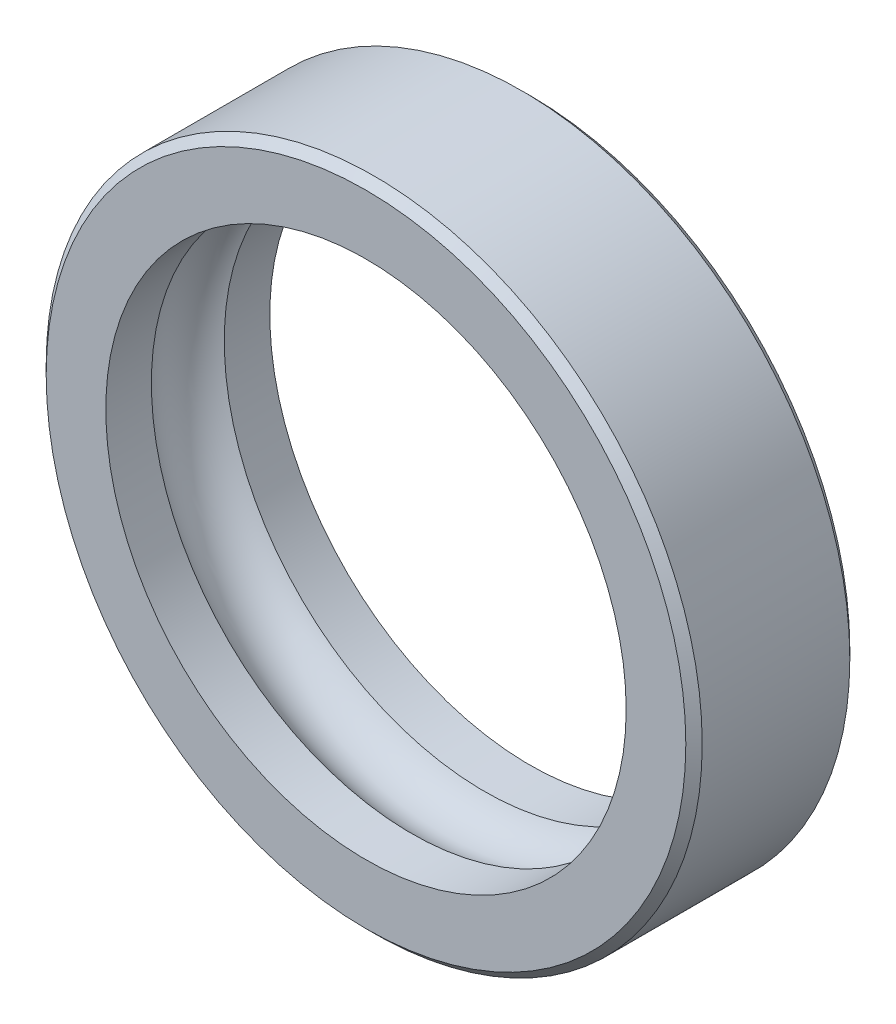
ISO-10303-21;
HEADER;
FILE_DESCRIPTION(('STEP AP214'),'2;1');
FILE_NAME('part.step','',(''),(''),'','','');
FILE_SCHEMA(('AUTOMOTIVE_DESIGN { 1 0 10303 214 1 1 1 1 }'));
ENDSEC;
DATA;
#1=APPLICATION_CONTEXT('core data for automotive mechanical design processes');
#2=APPLICATION_PROTOCOL_DEFINITION('international standard','automotive_design',2000,#1);
#3=PRODUCT_CONTEXT('',#1,'mechanical');
#4=PRODUCT('Part','Part','',(#3));
#5=PRODUCT_RELATED_PRODUCT_CATEGORY('part','',(#4));
#6=PRODUCT_DEFINITION_FORMATION('','',#4);
#7=PRODUCT_DEFINITION_CONTEXT('part definition',#1,'design');
#8=PRODUCT_DEFINITION('design','',#6,#7);
#9=PRODUCT_DEFINITION_SHAPE('','',#8);
#10=(LENGTH_UNIT() NAMED_UNIT(*) SI_UNIT(.MILLI.,.METRE.));
#11=(NAMED_UNIT(*) PLANE_ANGLE_UNIT() SI_UNIT($,.RADIAN.));
#12=(NAMED_UNIT(*) SI_UNIT($,.STERADIAN.) SOLID_ANGLE_UNIT());
#13=UNCERTAINTY_MEASURE_WITH_UNIT(LENGTH_MEASURE(1.E-05),#10,'distance_accuracy_value','');
#14=(GEOMETRIC_REPRESENTATION_CONTEXT(3) GLOBAL_UNCERTAINTY_ASSIGNED_CONTEXT((#13)) GLOBAL_UNIT_ASSIGNED_CONTEXT((#10,
#11,#12)) REPRESENTATION_CONTEXT('',''));
#15=CARTESIAN_POINT('',(0.,0.,0.));
#16=DIRECTION('',(0.,0.,1.));
#17=DIRECTION('',(1.,0.,0.));
#18=AXIS2_PLACEMENT_3D('',#15,#16,#17);
#19=CARTESIAN_POINT('',(18.72853125,-18.72853125,4.365625));
#20=DIRECTION('',(0.,0.,-1.));
#21=DIRECTION('',(0.,-1.,0.));
#22=AXIS2_PLACEMENT_3D('',#19,#20,#21);
#23=PLANE('',#22);
#24=CARTESIAN_POINT('',(0.,0.,4.365625));
#25=DIRECTION('',(0.,0.,1.));
#26=DIRECTION('',(1.,0.,0.));
#27=AXIS2_PLACEMENT_3D('',#24,#25,#26);
#28=CIRCLE('',#27,13.8513736263736);
#29=CARTESIAN_POINT('',(13.8513736263736,0.,4.365625));
#30=VERTEX_POINT('',#29);
#31=EDGE_CURVE('E22',#30,#30,#28,.T.);
#32=ORIENTED_EDGE('',*,*,#31,.F.);
#33=EDGE_LOOP('',(#32));
#34=FACE_BOUND('',#33,.T.);
#35=CARTESIAN_POINT('',(0.,0.,4.36562500751529));
#36=DIRECTION('',(0.,0.,-1.));
#37=DIRECTION('',(-1.,0.,0.));
#38=AXIS2_PLACEMENT_3D('',#35,#36,#37);
#39=CIRCLE('',#38,17.0259375075153);
#40=CARTESIAN_POINT('',(-17.0259375075153,0.,4.36562500751529));
#41=VERTEX_POINT('',#40);
#42=EDGE_CURVE('E36',#41,#41,#39,.T.);
#43=ORIENTED_EDGE('',*,*,#42,.F.);
#44=EDGE_LOOP('',(#43));
#45=FACE_BOUND('',#44,.T.);
#46=ADVANCED_FACE('F14',(#34,#45),#23,.F.);
#47=CARTESIAN_POINT('',(-18.72853125,-18.72853125,-4.365625));
#48=DIRECTION('',(0.,0.,1.));
#49=DIRECTION('',(1.,0.,0.));
#50=AXIS2_PLACEMENT_3D('',#47,#48,#49);
#51=PLANE('',#50);
#52=CARTESIAN_POINT('',(0.,0.,-4.365625));
#53=DIRECTION('',(0.,0.,-1.));
#54=DIRECTION('',(1.,0.,0.));
#55=AXIS2_PLACEMENT_3D('',#52,#53,#54);
#56=CIRCLE('',#55,13.8513736263736);
#57=CARTESIAN_POINT('',(13.8513736263736,0.,-4.365625));
#58=VERTEX_POINT('',#57);
#59=EDGE_CURVE('E9',#58,#58,#56,.T.);
#60=ORIENTED_EDGE('',*,*,#59,.F.);
#61=EDGE_LOOP('',(#60));
#62=FACE_BOUND('',#61,.T.);
#63=CARTESIAN_POINT('',(0.,0.,-4.36562500751529));
#64=DIRECTION('',(0.,0.,1.));
#65=DIRECTION('',(1.,0.,0.));
#66=AXIS2_PLACEMENT_3D('',#63,#64,#65);
#67=CIRCLE('',#66,17.0259375075153);
#68=CARTESIAN_POINT('',(17.0259375075153,0.,-4.36562500751529));
#69=VERTEX_POINT('',#68);
#70=EDGE_CURVE('E33',#69,#69,#67,.T.);
#71=ORIENTED_EDGE('',*,*,#70,.F.);
#72=EDGE_LOOP('',(#71));
#73=FACE_BOUND('',#72,.T.);
#74=ADVANCED_FACE('F70',(#62,#73),#51,.F.);
#75=CARTESIAN_POINT('',(0.,0.,-4.48689236111112));
#76=DIRECTION('',(0.,0.,1.));
#77=DIRECTION('',(1.,0.,0.));
#78=AXIS2_PLACEMENT_3D('',#75,#76,#77);
#79=CYLINDRICAL_SURFACE('',#78,13.8513736263736);
#80=CARTESIAN_POINT('',(0.,0.,-1.94027777777778));
#81=DIRECTION('',(0.,0.,-1.));
#82=DIRECTION('',(1.,0.,0.));
#83=AXIS2_PLACEMENT_3D('',#80,#81,#82);
#84=CIRCLE('',#83,13.8513736263736);
#85=CARTESIAN_POINT('',(13.8513736263736,0.,-1.94027777777778));
#86=VERTEX_POINT('',#85);
#87=EDGE_CURVE('E52',#86,#86,#84,.T.);
#88=ORIENTED_EDGE('',*,*,#87,.F.);
#89=EDGE_LOOP('',(#88));
#90=FACE_BOUND('',#89,.T.);
#91=ORIENTED_EDGE('',*,*,#59,.T.);
#92=EDGE_LOOP('',(#91));
#93=FACE_BOUND('',#92,.T.);
#94=ADVANCED_FACE('F65',(#90,#93),#79,.F.);
#95=CARTESIAN_POINT('',(0.,0.,1.81901041666666));
#96=DIRECTION('',(0.,0.,1.));
#97=DIRECTION('',(1.,0.,0.));
#98=AXIS2_PLACEMENT_3D('',#95,#96,#97);
#99=CYLINDRICAL_SURFACE('',#98,13.8513736263736);
#100=ORIENTED_EDGE('',*,*,#31,.T.);
#101=EDGE_LOOP('',(#100));
#102=FACE_BOUND('',#101,.T.);
#103=CARTESIAN_POINT('',(0.,0.,1.94027777777778));
#104=DIRECTION('',(0.,0.,1.));
#105=DIRECTION('',(1.,0.,0.));
#106=AXIS2_PLACEMENT_3D('',#103,#104,#105);
#107=CIRCLE('',#106,13.8513736263736);
#108=CARTESIAN_POINT('',(13.8513736263736,0.,1.94027777777778));
#109=VERTEX_POINT('',#108);
#110=EDGE_CURVE('E46',#109,#109,#107,.T.);
#111=ORIENTED_EDGE('',*,*,#110,.F.);
#112=EDGE_LOOP('',(#111));
#113=FACE_BOUND('',#112,.T.);
#114=ADVANCED_FACE('F16',(#102,#113),#99,.F.);
#115=CARTESIAN_POINT('',(0.,0.,-3.92906250712351));
#116=DIRECTION('',(0.,0.,1.));
#117=DIRECTION('',(1.,0.,0.));
#118=AXIS2_PLACEMENT_3D('',#115,#116,#117);
#119=CONICAL_SURFACE('',#118,17.4625000071235,0.785398162500003);
#120=CARTESIAN_POINT('',(0.,0.,-3.9290625));
#121=DIRECTION('',(0.,0.,1.));
#122=DIRECTION('',(1.,0.,0.));
#123=AXIS2_PLACEMENT_3D('',#120,#121,#122);
#124=CIRCLE('',#123,17.4625);
#125=CARTESIAN_POINT('',(17.4625,0.,-3.9290625));
#126=VERTEX_POINT('',#125);
#127=EDGE_CURVE('E41',#126,#126,#124,.T.);
#128=ORIENTED_EDGE('',*,*,#127,.F.);
#129=EDGE_LOOP('',(#128));
#130=FACE_BOUND('',#129,.T.);
#131=ORIENTED_EDGE('',*,*,#70,.T.);
#132=EDGE_LOOP('',(#131));
#133=FACE_BOUND('',#132,.T.);
#134=ADVANCED_FACE('F72',(#130,#133),#119,.T.);
#135=CARTESIAN_POINT('',(0.,0.,3.9290625071235));
#136=DIRECTION('',(0.,0.,-1.));
#137=DIRECTION('',(-1.,0.,0.));
#138=AXIS2_PLACEMENT_3D('',#135,#136,#137);
#139=CONICAL_SURFACE('',#138,17.4625000071235,0.785398162500003);
#140=CARTESIAN_POINT('',(0.,0.,3.9290625));
#141=DIRECTION('',(0.,0.,-1.));
#142=DIRECTION('',(1.,0.,0.));
#143=AXIS2_PLACEMENT_3D('',#140,#141,#142);
#144=CIRCLE('',#143,17.4625);
#145=CARTESIAN_POINT('',(17.4625,0.,3.9290625));
#146=VERTEX_POINT('',#145);
#147=EDGE_CURVE('E44',#146,#146,#144,.T.);
#148=ORIENTED_EDGE('',*,*,#147,.F.);
#149=EDGE_LOOP('',(#148));
#150=FACE_BOUND('',#149,.T.);
#151=ORIENTED_EDGE('',*,*,#42,.T.);
#152=EDGE_LOOP('',(#151));
#153=FACE_BOUND('',#152,.T.);
#154=ADVANCED_FACE('F88',(#150,#153),#139,.T.);
#155=CARTESIAN_POINT('',(0.,0.,-4.32196875));
#156=DIRECTION('',(0.,0.,1.));
#157=DIRECTION('',(1.,0.,0.));
#158=AXIS2_PLACEMENT_3D('',#155,#156,#157);
#159=CYLINDRICAL_SURFACE('',#158,17.4625);
#160=ORIENTED_EDGE('',*,*,#147,.T.);
#161=EDGE_LOOP('',(#160));
#162=FACE_BOUND('',#161,.T.);
#163=ORIENTED_EDGE('',*,*,#127,.T.);
#164=EDGE_LOOP('',(#163));
#165=FACE_BOUND('',#164,.T.);
#166=ADVANCED_FACE('F83',(#162,#165),#159,.T.);
#167=CARTESIAN_POINT('',(0.,0.,0.));
#168=DIRECTION('',(0.,0.,1.));
#169=DIRECTION('',(0.,-1.,0.));
#170=AXIS2_PLACEMENT_3D('',#167,#168,#169);
#171=TOROIDAL_SURFACE('',#170,12.7,2.25617798111035);
#172=ORIENTED_EDGE('',*,*,#110,.T.);
#173=EDGE_LOOP('',(#172));
#174=FACE_BOUND('',#173,.T.);
#175=ORIENTED_EDGE('',*,*,#87,.T.);
#176=EDGE_LOOP('',(#175));
#177=FACE_BOUND('',#176,.T.);
#178=ADVANCED_FACE('F64',(#174,#177),#171,.F.);
#179=CLOSED_SHELL('',(#46,#74,#94,#114,#134,#154,#166,#178));
#180=MANIFOLD_SOLID_BREP('B1',#179);
#181=ADVANCED_BREP_SHAPE_REPRESENTATION('',(#18,#180),#14);
#182=SHAPE_DEFINITION_REPRESENTATION(#9,#181);
ENDSEC;
END-ISO-10303-21;
